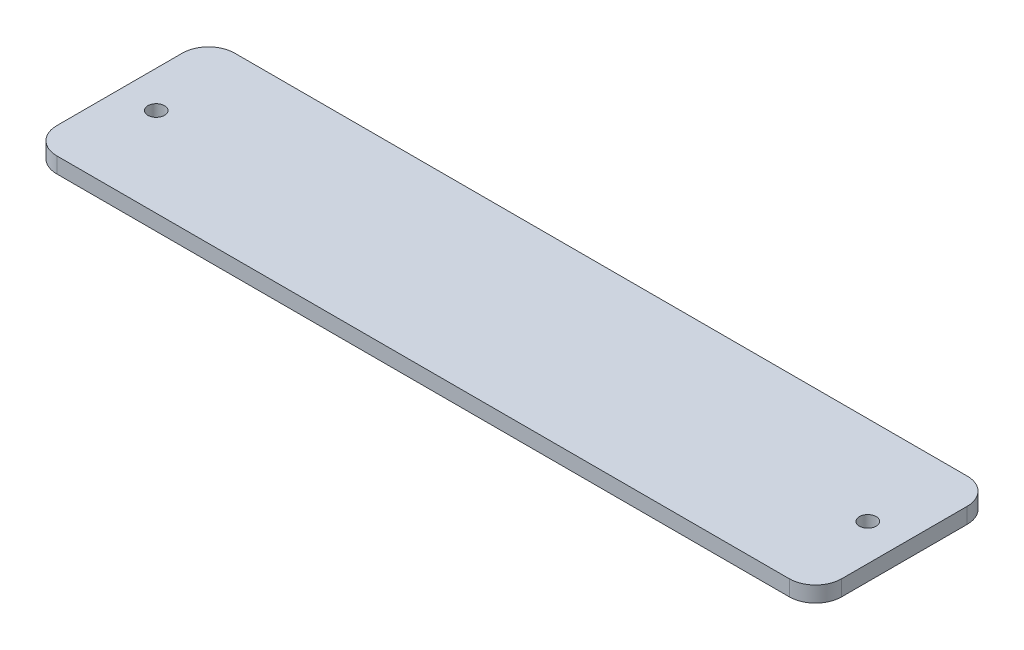
ISO-10303-21;
HEADER;
FILE_DESCRIPTION(('STEP AP214'),'2;1');
FILE_NAME('part.step','',(''),(''),'','','');
FILE_SCHEMA(('AUTOMOTIVE_DESIGN { 1 0 10303 214 1 1 1 1 }'));
ENDSEC;
DATA;
#1=APPLICATION_CONTEXT('core data for automotive mechanical design processes');
#2=APPLICATION_PROTOCOL_DEFINITION('international standard','automotive_design',2000,#1);
#3=PRODUCT_CONTEXT('',#1,'mechanical');
#4=PRODUCT('Part','Part','',(#3));
#5=PRODUCT_RELATED_PRODUCT_CATEGORY('part','',(#4));
#6=PRODUCT_DEFINITION_FORMATION('','',#4);
#7=PRODUCT_DEFINITION_CONTEXT('part definition',#1,'design');
#8=PRODUCT_DEFINITION('design','',#6,#7);
#9=PRODUCT_DEFINITION_SHAPE('','',#8);
#10=(LENGTH_UNIT() NAMED_UNIT(*) SI_UNIT(.MILLI.,.METRE.));
#11=(NAMED_UNIT(*) PLANE_ANGLE_UNIT() SI_UNIT($,.RADIAN.));
#12=(NAMED_UNIT(*) SI_UNIT($,.STERADIAN.) SOLID_ANGLE_UNIT());
#13=UNCERTAINTY_MEASURE_WITH_UNIT(LENGTH_MEASURE(1.E-05),#10,'distance_accuracy_value','');
#14=(GEOMETRIC_REPRESENTATION_CONTEXT(3) GLOBAL_UNCERTAINTY_ASSIGNED_CONTEXT((#13)) GLOBAL_UNIT_ASSIGNED_CONTEXT((#10,
#11,#12)) REPRESENTATION_CONTEXT('',''));
#15=CARTESIAN_POINT('',(0.,0.,0.));
#16=DIRECTION('',(0.,0.,1.));
#17=DIRECTION('',(1.,0.,0.));
#18=AXIS2_PLACEMENT_3D('',#15,#16,#17);
#19=CARTESIAN_POINT('',(0.,3.,0.));
#20=DIRECTION('',(0.,1.,0.));
#21=DIRECTION('',(0.,0.,1.));
#22=AXIS2_PLACEMENT_3D('',#19,#20,#21);
#23=PLANE('',#22);
#24=CARTESIAN_POINT('',(7.,3.,-25.));
#25=DIRECTION('',(0.,1.,0.));
#26=DIRECTION('',(0.,0.,1.));
#27=AXIS2_PLACEMENT_3D('',#24,#25,#26);
#28=CIRCLE('',#27,1.6);
#29=CARTESIAN_POINT('',(7.,3.,-23.4));
#30=VERTEX_POINT('',#29);
#31=EDGE_CURVE('E160',#30,#30,#28,.T.);
#32=ORIENTED_EDGE('',*,*,#31,.F.);
#33=EDGE_LOOP('',(#32));
#34=FACE_BOUND('',#33,.T.);
#35=DIRECTION('',(0.,0.,-1.));
#36=VECTOR('',#35,1.);
#37=CARTESIAN_POINT('',(150.,3.,-42.));
#38=LINE('',#37,#36);
#39=CARTESIAN_POINT('',(150.,3.,-13.));
#40=VERTEX_POINT('',#39);
#41=CARTESIAN_POINT('',(150.,3.,-37.));
#42=VERTEX_POINT('',#41);
#43=EDGE_CURVE('E164',#40,#42,#38,.T.);
#44=ORIENTED_EDGE('',*,*,#43,.T.);
#45=CARTESIAN_POINT('',(145.,3.,-37.));
#46=DIRECTION('',(0.,1.,0.));
#47=DIRECTION('',(0.,0.,1.));
#48=AXIS2_PLACEMENT_3D('',#45,#46,#47);
#49=CIRCLE('',#48,5.);
#50=CARTESIAN_POINT('',(145.,3.,-42.));
#51=VERTEX_POINT('',#50);
#52=EDGE_CURVE('E147',#42,#51,#49,.T.);
#53=ORIENTED_EDGE('',*,*,#52,.T.);
#54=DIRECTION('',(-1.,0.,0.));
#55=VECTOR('',#54,1.);
#56=CARTESIAN_POINT('',(0.,3.,-42.));
#57=LINE('',#56,#55);
#58=CARTESIAN_POINT('',(5.,3.,-42.));
#59=VERTEX_POINT('',#58);
#60=EDGE_CURVE('E118',#51,#59,#57,.T.);
#61=ORIENTED_EDGE('',*,*,#60,.T.);
#62=CARTESIAN_POINT('',(5.,3.,-37.));
#63=DIRECTION('',(0.,1.,0.));
#64=DIRECTION('',(0.,0.,1.));
#65=AXIS2_PLACEMENT_3D('',#62,#63,#64);
#66=CIRCLE('',#65,5.);
#67=CARTESIAN_POINT('',(0.,3.,-37.));
#68=VERTEX_POINT('',#67);
#69=EDGE_CURVE('E145',#59,#68,#66,.T.);
#70=ORIENTED_EDGE('',*,*,#69,.T.);
#71=DIRECTION('',(0.,0.,1.));
#72=VECTOR('',#71,1.);
#73=CARTESIAN_POINT('',(0.,3.,-42.));
#74=LINE('',#73,#72);
#75=CARTESIAN_POINT('',(0.,3.,-13.));
#76=VERTEX_POINT('',#75);
#77=EDGE_CURVE('E125',#68,#76,#74,.T.);
#78=ORIENTED_EDGE('',*,*,#77,.T.);
#79=CARTESIAN_POINT('',(5.,3.,-13.));
#80=DIRECTION('',(0.,1.,0.));
#81=DIRECTION('',(0.,0.,1.));
#82=AXIS2_PLACEMENT_3D('',#79,#80,#81);
#83=CIRCLE('',#82,5.);
#84=CARTESIAN_POINT('',(5.,3.,-8.));
#85=VERTEX_POINT('',#84);
#86=EDGE_CURVE('E53',#76,#85,#83,.T.);
#87=ORIENTED_EDGE('',*,*,#86,.T.);
#88=DIRECTION('',(1.,0.,0.));
#89=VECTOR('',#88,1.);
#90=CARTESIAN_POINT('',(0.,3.,-8.));
#91=LINE('',#90,#89);
#92=CARTESIAN_POINT('',(145.,3.,-8.));
#93=VERTEX_POINT('',#92);
#94=EDGE_CURVE('E128',#85,#93,#91,.T.);
#95=ORIENTED_EDGE('',*,*,#94,.T.);
#96=CARTESIAN_POINT('',(145.,3.,-13.));
#97=DIRECTION('',(0.,1.,0.));
#98=DIRECTION('',(0.,0.,1.));
#99=AXIS2_PLACEMENT_3D('',#96,#97,#98);
#100=CIRCLE('',#99,5.);
#101=EDGE_CURVE('E143',#93,#40,#100,.T.);
#102=ORIENTED_EDGE('',*,*,#101,.T.);
#103=EDGE_LOOP('',(#44,#53,#61,#70,#78,#87,#95,#102));
#104=FACE_BOUND('',#103,.T.);
#105=CARTESIAN_POINT('',(143.,3.,-25.));
#106=DIRECTION('',(0.,1.,0.));
#107=DIRECTION('',(0.,0.,-1.));
#108=AXIS2_PLACEMENT_3D('',#105,#106,#107);
#109=CIRCLE('',#108,1.59999999999999);
#110=CARTESIAN_POINT('',(143.,3.,-26.6));
#111=VERTEX_POINT('',#110);
#112=EDGE_CURVE('E171',#111,#111,#109,.T.);
#113=ORIENTED_EDGE('',*,*,#112,.F.);
#114=EDGE_LOOP('',(#113));
#115=FACE_BOUND('',#114,.T.);
#116=ADVANCED_FACE('F33',(#34,#104,#115),#23,.T.);
#117=CARTESIAN_POINT('',(0.,0.,0.));
#118=DIRECTION('',(0.,1.,0.));
#119=DIRECTION('',(0.,0.,1.));
#120=AXIS2_PLACEMENT_3D('',#117,#118,#119);
#121=PLANE('',#120);
#122=CARTESIAN_POINT('',(7.,0.,-25.));
#123=DIRECTION('',(0.,1.,0.));
#124=DIRECTION('',(0.,0.,1.));
#125=AXIS2_PLACEMENT_3D('',#122,#123,#124);
#126=CIRCLE('',#125,1.6);
#127=CARTESIAN_POINT('',(7.,0.,-23.4));
#128=VERTEX_POINT('',#127);
#129=EDGE_CURVE('E168',#128,#128,#126,.T.);
#130=ORIENTED_EDGE('',*,*,#129,.T.);
#131=EDGE_LOOP('',(#130));
#132=FACE_BOUND('',#131,.T.);
#133=DIRECTION('',(-1.,0.,0.));
#134=VECTOR('',#133,1.);
#135=CARTESIAN_POINT('',(0.,0.,-42.));
#136=LINE('',#135,#134);
#137=CARTESIAN_POINT('',(145.,0.,-42.));
#138=VERTEX_POINT('',#137);
#139=CARTESIAN_POINT('',(5.,0.,-42.));
#140=VERTEX_POINT('',#139);
#141=EDGE_CURVE('E115',#138,#140,#136,.T.);
#142=ORIENTED_EDGE('',*,*,#141,.F.);
#143=CARTESIAN_POINT('',(145.,0.,-37.));
#144=DIRECTION('',(0.,1.,0.));
#145=DIRECTION('',(0.,0.,1.));
#146=AXIS2_PLACEMENT_3D('',#143,#144,#145);
#147=CIRCLE('',#146,5.);
#148=CARTESIAN_POINT('',(150.,0.,-37.));
#149=VERTEX_POINT('',#148);
#150=EDGE_CURVE('E98',#138,#149,#147,.F.);
#151=ORIENTED_EDGE('',*,*,#150,.T.);
#152=DIRECTION('',(0.,0.,-1.));
#153=VECTOR('',#152,1.);
#154=CARTESIAN_POINT('',(150.,0.,-42.));
#155=LINE('',#154,#153);
#156=CARTESIAN_POINT('',(150.,0.,-13.));
#157=VERTEX_POINT('',#156);
#158=EDGE_CURVE('E126',#157,#149,#155,.T.);
#159=ORIENTED_EDGE('',*,*,#158,.F.);
#160=CARTESIAN_POINT('',(145.,0.,-13.));
#161=DIRECTION('',(0.,1.,0.));
#162=DIRECTION('',(0.,0.,1.));
#163=AXIS2_PLACEMENT_3D('',#160,#161,#162);
#164=CIRCLE('',#163,5.);
#165=CARTESIAN_POINT('',(145.,0.,-8.));
#166=VERTEX_POINT('',#165);
#167=EDGE_CURVE('E136',#157,#166,#164,.F.);
#168=ORIENTED_EDGE('',*,*,#167,.T.);
#169=DIRECTION('',(1.,0.,0.));
#170=VECTOR('',#169,1.);
#171=CARTESIAN_POINT('',(0.,0.,-8.));
#172=LINE('',#171,#170);
#173=CARTESIAN_POINT('',(5.,0.,-8.));
#174=VERTEX_POINT('',#173);
#175=EDGE_CURVE('E130',#174,#166,#172,.T.);
#176=ORIENTED_EDGE('',*,*,#175,.F.);
#177=CARTESIAN_POINT('',(5.,0.,-13.));
#178=DIRECTION('',(0.,1.,0.));
#179=DIRECTION('',(0.,0.,1.));
#180=AXIS2_PLACEMENT_3D('',#177,#178,#179);
#181=CIRCLE('',#180,5.);
#182=CARTESIAN_POINT('',(0.,0.,-13.));
#183=VERTEX_POINT('',#182);
#184=EDGE_CURVE('E119',#174,#183,#181,.F.);
#185=ORIENTED_EDGE('',*,*,#184,.T.);
#186=DIRECTION('',(0.,0.,1.));
#187=VECTOR('',#186,1.);
#188=CARTESIAN_POINT('',(0.,0.,-42.));
#189=LINE('',#188,#187);
#190=CARTESIAN_POINT('',(0.,0.,-37.));
#191=VERTEX_POINT('',#190);
#192=EDGE_CURVE('E159',#191,#183,#189,.T.);
#193=ORIENTED_EDGE('',*,*,#192,.F.);
#194=CARTESIAN_POINT('',(5.,0.,-37.));
#195=DIRECTION('',(0.,1.,0.));
#196=DIRECTION('',(0.,0.,1.));
#197=AXIS2_PLACEMENT_3D('',#194,#195,#196);
#198=CIRCLE('',#197,5.);
#199=EDGE_CURVE('E109',#191,#140,#198,.F.);
#200=ORIENTED_EDGE('',*,*,#199,.T.);
#201=EDGE_LOOP('',(#142,#151,#159,#168,#176,#185,#193,#200));
#202=FACE_BOUND('',#201,.T.);
#203=CARTESIAN_POINT('',(143.,0.,-25.));
#204=DIRECTION('',(0.,1.,0.));
#205=DIRECTION('',(0.,0.,-1.));
#206=AXIS2_PLACEMENT_3D('',#203,#204,#205);
#207=CIRCLE('',#206,1.59999999999999);
#208=CARTESIAN_POINT('',(143.,0.,-26.6));
#209=VERTEX_POINT('',#208);
#210=EDGE_CURVE('E174',#209,#209,#207,.T.);
#211=ORIENTED_EDGE('',*,*,#210,.T.);
#212=EDGE_LOOP('',(#211));
#213=FACE_BOUND('',#212,.T.);
#214=ADVANCED_FACE('F122',(#132,#202,#213),#121,.F.);
#215=CARTESIAN_POINT('',(0.,3.,-42.));
#216=DIRECTION('',(1.,0.,0.));
#217=DIRECTION('',(0.,0.,-1.));
#218=AXIS2_PLACEMENT_3D('',#215,#216,#217);
#219=PLANE('',#218);
#220=ORIENTED_EDGE('',*,*,#77,.F.);
#221=DIRECTION('',(0.,-1.,0.));
#222=VECTOR('',#221,1.);
#223=CARTESIAN_POINT('',(0.,3.,-37.));
#224=LINE('',#223,#222);
#225=EDGE_CURVE('E151',#68,#191,#224,.T.);
#226=ORIENTED_EDGE('',*,*,#225,.T.);
#227=ORIENTED_EDGE('',*,*,#192,.T.);
#228=DIRECTION('',(0.,-1.,0.));
#229=VECTOR('',#228,1.);
#230=CARTESIAN_POINT('',(0.,3.,-13.));
#231=LINE('',#230,#229);
#232=EDGE_CURVE('E149',#183,#76,#231,.F.);
#233=ORIENTED_EDGE('',*,*,#232,.T.);
#234=EDGE_LOOP('',(#220,#226,#227,#233));
#235=FACE_BOUND('',#234,.T.);
#236=ADVANCED_FACE('F189',(#235),#219,.F.);
#237=CARTESIAN_POINT('',(0.,3.,-8.));
#238=DIRECTION('',(0.,0.,-1.));
#239=DIRECTION('',(-1.,0.,0.));
#240=AXIS2_PLACEMENT_3D('',#237,#238,#239);
#241=PLANE('',#240);
#242=ORIENTED_EDGE('',*,*,#175,.T.);
#243=DIRECTION('',(0.,-1.,0.));
#244=VECTOR('',#243,1.);
#245=CARTESIAN_POINT('',(145.,3.,-8.));
#246=LINE('',#245,#244);
#247=EDGE_CURVE('E11',#166,#93,#246,.F.);
#248=ORIENTED_EDGE('',*,*,#247,.T.);
#249=ORIENTED_EDGE('',*,*,#94,.F.);
#250=DIRECTION('',(0.,-1.,0.));
#251=VECTOR('',#250,1.);
#252=CARTESIAN_POINT('',(5.,3.,-8.));
#253=LINE('',#252,#251);
#254=EDGE_CURVE('E41',#85,#174,#253,.T.);
#255=ORIENTED_EDGE('',*,*,#254,.T.);
#256=EDGE_LOOP('',(#242,#248,#249,#255));
#257=FACE_BOUND('',#256,.T.);
#258=ADVANCED_FACE('F156',(#257),#241,.F.);
#259=CARTESIAN_POINT('',(150.,3.,-42.));
#260=DIRECTION('',(-1.,0.,0.));
#261=DIRECTION('',(0.,0.,1.));
#262=AXIS2_PLACEMENT_3D('',#259,#260,#261);
#263=PLANE('',#262);
#264=ORIENTED_EDGE('',*,*,#158,.T.);
#265=DIRECTION('',(0.,-1.,0.));
#266=VECTOR('',#265,1.);
#267=CARTESIAN_POINT('',(150.,3.,-37.));
#268=LINE('',#267,#266);
#269=EDGE_CURVE('E103',#149,#42,#268,.F.);
#270=ORIENTED_EDGE('',*,*,#269,.T.);
#271=ORIENTED_EDGE('',*,*,#43,.F.);
#272=DIRECTION('',(0.,-1.,0.));
#273=VECTOR('',#272,1.);
#274=CARTESIAN_POINT('',(150.,3.,-13.));
#275=LINE('',#274,#273);
#276=EDGE_CURVE('E108',#40,#157,#275,.T.);
#277=ORIENTED_EDGE('',*,*,#276,.T.);
#278=EDGE_LOOP('',(#264,#270,#271,#277));
#279=FACE_BOUND('',#278,.T.);
#280=ADVANCED_FACE('F199',(#279),#263,.F.);
#281=CARTESIAN_POINT('',(0.,3.,-42.));
#282=DIRECTION('',(0.,0.,1.));
#283=DIRECTION('',(1.,0.,0.));
#284=AXIS2_PLACEMENT_3D('',#281,#282,#283);
#285=PLANE('',#284);
#286=ORIENTED_EDGE('',*,*,#60,.F.);
#287=DIRECTION('',(0.,-1.,0.));
#288=VECTOR('',#287,1.);
#289=CARTESIAN_POINT('',(145.,3.,-42.));
#290=LINE('',#289,#288);
#291=EDGE_CURVE('E102',#51,#138,#290,.T.);
#292=ORIENTED_EDGE('',*,*,#291,.T.);
#293=ORIENTED_EDGE('',*,*,#141,.T.);
#294=DIRECTION('',(0.,-1.,0.));
#295=VECTOR('',#294,1.);
#296=CARTESIAN_POINT('',(5.,3.,-42.));
#297=LINE('',#296,#295);
#298=EDGE_CURVE('E120',#140,#59,#297,.F.);
#299=ORIENTED_EDGE('',*,*,#298,.T.);
#300=EDGE_LOOP('',(#286,#292,#293,#299));
#301=FACE_BOUND('',#300,.T.);
#302=ADVANCED_FACE('F114',(#301),#285,.F.);
#303=CARTESIAN_POINT('',(7.,3.,-25.));
#304=DIRECTION('',(0.,-1.,0.));
#305=DIRECTION('',(0.,0.,-1.));
#306=AXIS2_PLACEMENT_3D('',#303,#304,#305);
#307=CYLINDRICAL_SURFACE('',#306,1.6);
#308=ORIENTED_EDGE('',*,*,#31,.T.);
#309=EDGE_LOOP('',(#308));
#310=FACE_BOUND('',#309,.T.);
#311=ORIENTED_EDGE('',*,*,#129,.F.);
#312=EDGE_LOOP('',(#311));
#313=FACE_BOUND('',#312,.T.);
#314=ADVANCED_FACE('F194',(#310,#313),#307,.F.);
#315=CARTESIAN_POINT('',(143.,3.,-25.));
#316=DIRECTION('',(0.,-1.,0.));
#317=DIRECTION('',(0.,0.,-1.));
#318=AXIS2_PLACEMENT_3D('',#315,#316,#317);
#319=CYLINDRICAL_SURFACE('',#318,1.59999999999999);
#320=ORIENTED_EDGE('',*,*,#112,.T.);
#321=EDGE_LOOP('',(#320));
#322=FACE_BOUND('',#321,.T.);
#323=ORIENTED_EDGE('',*,*,#210,.F.);
#324=EDGE_LOOP('',(#323));
#325=FACE_BOUND('',#324,.T.);
#326=ADVANCED_FACE('F180',(#322,#325),#319,.F.);
#327=CARTESIAN_POINT('',(145.,3.,-37.));
#328=DIRECTION('',(0.,-1.,0.));
#329=DIRECTION('',(0.,0.,-1.));
#330=AXIS2_PLACEMENT_3D('',#327,#328,#329);
#331=CYLINDRICAL_SURFACE('',#330,5.);
#332=ORIENTED_EDGE('',*,*,#52,.F.);
#333=ORIENTED_EDGE('',*,*,#269,.F.);
#334=ORIENTED_EDGE('',*,*,#150,.F.);
#335=ORIENTED_EDGE('',*,*,#291,.F.);
#336=EDGE_LOOP('',(#332,#333,#334,#335));
#337=FACE_BOUND('',#336,.T.);
#338=ADVANCED_FACE('F101',(#337),#331,.T.);
#339=CARTESIAN_POINT('',(5.,3.,-37.));
#340=DIRECTION('',(0.,-1.,0.));
#341=DIRECTION('',(0.,0.,-1.));
#342=AXIS2_PLACEMENT_3D('',#339,#340,#341);
#343=CYLINDRICAL_SURFACE('',#342,5.);
#344=ORIENTED_EDGE('',*,*,#69,.F.);
#345=ORIENTED_EDGE('',*,*,#298,.F.);
#346=ORIENTED_EDGE('',*,*,#199,.F.);
#347=ORIENTED_EDGE('',*,*,#225,.F.);
#348=EDGE_LOOP('',(#344,#345,#346,#347));
#349=FACE_BOUND('',#348,.T.);
#350=ADVANCED_FACE('F210',(#349),#343,.T.);
#351=CARTESIAN_POINT('',(145.,3.,-13.));
#352=DIRECTION('',(0.,-1.,0.));
#353=DIRECTION('',(0.,0.,-1.));
#354=AXIS2_PLACEMENT_3D('',#351,#352,#353);
#355=CYLINDRICAL_SURFACE('',#354,5.);
#356=ORIENTED_EDGE('',*,*,#101,.F.);
#357=ORIENTED_EDGE('',*,*,#247,.F.);
#358=ORIENTED_EDGE('',*,*,#167,.F.);
#359=ORIENTED_EDGE('',*,*,#276,.F.);
#360=EDGE_LOOP('',(#356,#357,#358,#359));
#361=FACE_BOUND('',#360,.T.);
#362=ADVANCED_FACE('F212',(#361),#355,.T.);
#363=CARTESIAN_POINT('',(5.,3.,-13.));
#364=DIRECTION('',(0.,-1.,0.));
#365=DIRECTION('',(0.,0.,-1.));
#366=AXIS2_PLACEMENT_3D('',#363,#364,#365);
#367=CYLINDRICAL_SURFACE('',#366,5.);
#368=ORIENTED_EDGE('',*,*,#86,.F.);
#369=ORIENTED_EDGE('',*,*,#232,.F.);
#370=ORIENTED_EDGE('',*,*,#184,.F.);
#371=ORIENTED_EDGE('',*,*,#254,.F.);
#372=EDGE_LOOP('',(#368,#369,#370,#371));
#373=FACE_BOUND('',#372,.T.);
#374=ADVANCED_FACE('F35',(#373),#367,.T.);
#375=CLOSED_SHELL('',(#116,#214,#236,#258,#280,#302,#314,#326,#338,#350,#362,#374));
#376=MANIFOLD_SOLID_BREP('B2',#375);
#377=ADVANCED_BREP_SHAPE_REPRESENTATION('',(#18,#376),#14);
#378=SHAPE_DEFINITION_REPRESENTATION(#9,#377);
ENDSEC;
END-ISO-10303-21;
